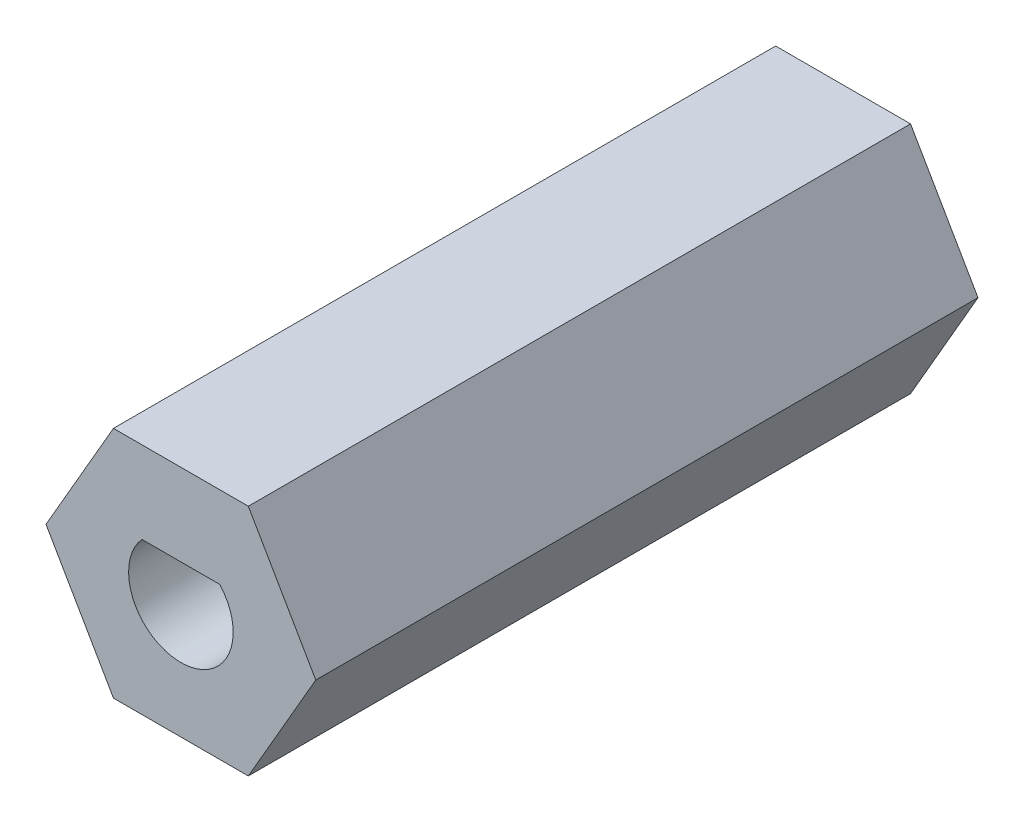
ISO-10303-21;
HEADER;
FILE_DESCRIPTION(('STEP AP214'),'2;1');
FILE_NAME('part.step','',(''),(''),'','','');
FILE_SCHEMA(('AUTOMOTIVE_DESIGN { 1 0 10303 214 1 1 1 1 }'));
ENDSEC;
DATA;
#1=APPLICATION_CONTEXT('core data for automotive mechanical design processes');
#2=APPLICATION_PROTOCOL_DEFINITION('international standard','automotive_design',2000,#1);
#3=PRODUCT_CONTEXT('',#1,'mechanical');
#4=PRODUCT('Part','Part','',(#3));
#5=PRODUCT_RELATED_PRODUCT_CATEGORY('part','',(#4));
#6=PRODUCT_DEFINITION_FORMATION('','',#4);
#7=PRODUCT_DEFINITION_CONTEXT('part definition',#1,'design');
#8=PRODUCT_DEFINITION('design','',#6,#7);
#9=PRODUCT_DEFINITION_SHAPE('','',#8);
#10=(LENGTH_UNIT() NAMED_UNIT(*) SI_UNIT(.MILLI.,.METRE.));
#11=(NAMED_UNIT(*) PLANE_ANGLE_UNIT() SI_UNIT($,.RADIAN.));
#12=(NAMED_UNIT(*) SI_UNIT($,.STERADIAN.) SOLID_ANGLE_UNIT());
#13=UNCERTAINTY_MEASURE_WITH_UNIT(LENGTH_MEASURE(1.E-05),#10,'distance_accuracy_value','');
#14=(GEOMETRIC_REPRESENTATION_CONTEXT(3) GLOBAL_UNCERTAINTY_ASSIGNED_CONTEXT((#13)) GLOBAL_UNIT_ASSIGNED_CONTEXT((#10,
#11,#12)) REPRESENTATION_CONTEXT('',''));
#15=CARTESIAN_POINT('',(0.,0.,0.));
#16=DIRECTION('',(0.,0.,1.));
#17=DIRECTION('',(1.,0.,0.));
#18=AXIS2_PLACEMENT_3D('',#15,#16,#17);
#19=CARTESIAN_POINT('',(1.935,3.35151831264578,19.));
#20=DIRECTION('',(-0.86602540378444,-0.499999999999998,0.));
#21=DIRECTION('',(0.499999999999998,-0.86602540378444,0.));
#22=AXIS2_PLACEMENT_3D('',#19,#20,#21);
#23=PLANE('',#22);
#24=DIRECTION('',(-0.499999999999998,0.86602540378444,0.));
#25=VECTOR('',#24,1.);
#26=CARTESIAN_POINT('',(1.935,3.35151831264578,0.));
#27=LINE('',#26,#25);
#28=CARTESIAN_POINT('',(3.86999999999999,0.,0.));
#29=VERTEX_POINT('',#28);
#30=CARTESIAN_POINT('',(1.935,3.35151831264578,0.));
#31=VERTEX_POINT('',#30);
#32=EDGE_CURVE('E139',#29,#31,#27,.T.);
#33=ORIENTED_EDGE('',*,*,#32,.T.);
#34=DIRECTION('',(0.,0.,-1.));
#35=VECTOR('',#34,1.);
#36=CARTESIAN_POINT('',(1.935,3.35151831264578,19.));
#37=LINE('',#36,#35);
#38=CARTESIAN_POINT('',(1.935,3.35151831264578,19.));
#39=VERTEX_POINT('',#38);
#40=EDGE_CURVE('E11',#39,#31,#37,.T.);
#41=ORIENTED_EDGE('',*,*,#40,.F.);
#42=DIRECTION('',(-0.499999999999998,0.86602540378444,0.));
#43=VECTOR('',#42,1.);
#44=CARTESIAN_POINT('',(1.935,3.35151831264578,19.));
#45=LINE('',#44,#43);
#46=CARTESIAN_POINT('',(3.86999999999999,0.,19.));
#47=VERTEX_POINT('',#46);
#48=EDGE_CURVE('E151',#47,#39,#45,.T.);
#49=ORIENTED_EDGE('',*,*,#48,.F.);
#50=DIRECTION('',(0.,0.,-1.));
#51=VECTOR('',#50,1.);
#52=CARTESIAN_POINT('',(3.86999999999999,0.,19.));
#53=LINE('',#52,#51);
#54=EDGE_CURVE('E135',#47,#29,#53,.T.);
#55=ORIENTED_EDGE('',*,*,#54,.T.);
#56=EDGE_LOOP('',(#33,#41,#49,#55));
#57=FACE_BOUND('',#56,.T.);
#58=ADVANCED_FACE('F43',(#57),#23,.F.);
#59=CARTESIAN_POINT('',(-1.935,3.35151831264578,19.));
#60=DIRECTION('',(0.,-1.,0.));
#61=DIRECTION('',(0.,0.,-1.));
#62=AXIS2_PLACEMENT_3D('',#59,#60,#61);
#63=PLANE('',#62);
#64=DIRECTION('',(-1.,0.,0.));
#65=VECTOR('',#64,1.);
#66=CARTESIAN_POINT('',(-1.935,3.35151831264578,0.));
#67=LINE('',#66,#65);
#68=CARTESIAN_POINT('',(-1.935,3.35151831264578,0.));
#69=VERTEX_POINT('',#68);
#70=EDGE_CURVE('E142',#31,#69,#67,.T.);
#71=ORIENTED_EDGE('',*,*,#70,.T.);
#72=DIRECTION('',(0.,0.,-1.));
#73=VECTOR('',#72,1.);
#74=CARTESIAN_POINT('',(-1.935,3.35151831264578,19.));
#75=LINE('',#74,#73);
#76=CARTESIAN_POINT('',(-1.935,3.35151831264578,19.));
#77=VERTEX_POINT('',#76);
#78=EDGE_CURVE('E50',#77,#69,#75,.T.);
#79=ORIENTED_EDGE('',*,*,#78,.F.);
#80=DIRECTION('',(-1.,0.,0.));
#81=VECTOR('',#80,1.);
#82=CARTESIAN_POINT('',(-1.935,3.35151831264578,19.));
#83=LINE('',#82,#81);
#84=EDGE_CURVE('E101',#39,#77,#83,.T.);
#85=ORIENTED_EDGE('',*,*,#84,.F.);
#86=ORIENTED_EDGE('',*,*,#40,.T.);
#87=EDGE_LOOP('',(#71,#79,#85,#86));
#88=FACE_BOUND('',#87,.T.);
#89=ADVANCED_FACE('F211',(#88),#63,.F.);
#90=CARTESIAN_POINT('',(-1.935,3.35151831264578,19.));
#91=DIRECTION('',(0.86602540378444,-0.499999999999998,0.));
#92=DIRECTION('',(0.499999999999998,0.86602540378444,0.));
#93=AXIS2_PLACEMENT_3D('',#90,#91,#92);
#94=PLANE('',#93);
#95=DIRECTION('',(-0.499999999999998,-0.86602540378444,0.));
#96=VECTOR('',#95,1.);
#97=CARTESIAN_POINT('',(-1.935,3.35151831264578,0.));
#98=LINE('',#97,#96);
#99=CARTESIAN_POINT('',(-3.86999999999999,0.,0.));
#100=VERTEX_POINT('',#99);
#101=EDGE_CURVE('E145',#69,#100,#98,.T.);
#102=ORIENTED_EDGE('',*,*,#101,.T.);
#103=DIRECTION('',(0.,0.,-1.));
#104=VECTOR('',#103,1.);
#105=CARTESIAN_POINT('',(-3.86999999999999,0.,19.));
#106=LINE('',#105,#104);
#107=CARTESIAN_POINT('',(-3.86999999999999,0.,19.));
#108=VERTEX_POINT('',#107);
#109=EDGE_CURVE('E130',#108,#100,#106,.T.);
#110=ORIENTED_EDGE('',*,*,#109,.F.);
#111=DIRECTION('',(-0.499999999999998,-0.86602540378444,0.));
#112=VECTOR('',#111,1.);
#113=CARTESIAN_POINT('',(-1.935,3.35151831264578,19.));
#114=LINE('',#113,#112);
#115=EDGE_CURVE('E118',#77,#108,#114,.T.);
#116=ORIENTED_EDGE('',*,*,#115,.F.);
#117=ORIENTED_EDGE('',*,*,#78,.T.);
#118=EDGE_LOOP('',(#102,#110,#116,#117));
#119=FACE_BOUND('',#118,.T.);
#120=ADVANCED_FACE('F157',(#119),#94,.F.);
#121=CARTESIAN_POINT('',(-1.935,-3.35151831264578,19.));
#122=DIRECTION('',(0.86602540378444,0.499999999999998,0.));
#123=DIRECTION('',(-0.499999999999998,0.86602540378444,0.));
#124=AXIS2_PLACEMENT_3D('',#121,#122,#123);
#125=PLANE('',#124);
#126=DIRECTION('',(0.499999999999998,-0.86602540378444,0.));
#127=VECTOR('',#126,1.);
#128=CARTESIAN_POINT('',(-1.935,-3.35151831264578,0.));
#129=LINE('',#128,#127);
#130=CARTESIAN_POINT('',(-1.935,-3.35151831264578,0.));
#131=VERTEX_POINT('',#130);
#132=EDGE_CURVE('E127',#100,#131,#129,.T.);
#133=ORIENTED_EDGE('',*,*,#132,.T.);
#134=DIRECTION('',(0.,0.,-1.));
#135=VECTOR('',#134,1.);
#136=CARTESIAN_POINT('',(-1.935,-3.35151831264578,19.));
#137=LINE('',#136,#135);
#138=CARTESIAN_POINT('',(-1.935,-3.35151831264578,19.));
#139=VERTEX_POINT('',#138);
#140=EDGE_CURVE('E124',#139,#131,#137,.T.);
#141=ORIENTED_EDGE('',*,*,#140,.F.);
#142=DIRECTION('',(0.499999999999998,-0.86602540378444,0.));
#143=VECTOR('',#142,1.);
#144=CARTESIAN_POINT('',(-1.935,-3.35151831264578,19.));
#145=LINE('',#144,#143);
#146=EDGE_CURVE('E111',#108,#139,#145,.T.);
#147=ORIENTED_EDGE('',*,*,#146,.F.);
#148=ORIENTED_EDGE('',*,*,#109,.T.);
#149=EDGE_LOOP('',(#133,#141,#147,#148));
#150=FACE_BOUND('',#149,.T.);
#151=ADVANCED_FACE('F125',(#150),#125,.F.);
#152=CARTESIAN_POINT('',(-1.935,-3.35151831264578,19.));
#153=DIRECTION('',(0.,1.,0.));
#154=DIRECTION('',(0.,0.,1.));
#155=AXIS2_PLACEMENT_3D('',#152,#153,#154);
#156=PLANE('',#155);
#157=DIRECTION('',(1.,0.,0.));
#158=VECTOR('',#157,1.);
#159=CARTESIAN_POINT('',(-1.935,-3.35151831264578,0.));
#160=LINE('',#159,#158);
#161=CARTESIAN_POINT('',(1.935,-3.35151831264578,0.));
#162=VERTEX_POINT('',#161);
#163=EDGE_CURVE('E148',#131,#162,#160,.T.);
#164=ORIENTED_EDGE('',*,*,#163,.T.);
#165=DIRECTION('',(0.,0.,-1.));
#166=VECTOR('',#165,1.);
#167=CARTESIAN_POINT('',(1.935,-3.35151831264578,19.));
#168=LINE('',#167,#166);
#169=CARTESIAN_POINT('',(1.935,-3.35151831264578,19.));
#170=VERTEX_POINT('',#169);
#171=EDGE_CURVE('E131',#170,#162,#168,.T.);
#172=ORIENTED_EDGE('',*,*,#171,.F.);
#173=DIRECTION('',(1.,0.,0.));
#174=VECTOR('',#173,1.);
#175=CARTESIAN_POINT('',(-1.935,-3.35151831264578,19.));
#176=LINE('',#175,#174);
#177=EDGE_CURVE('E115',#139,#170,#176,.T.);
#178=ORIENTED_EDGE('',*,*,#177,.F.);
#179=ORIENTED_EDGE('',*,*,#140,.T.);
#180=EDGE_LOOP('',(#164,#172,#178,#179));
#181=FACE_BOUND('',#180,.T.);
#182=ADVANCED_FACE('F133',(#181),#156,.F.);
#183=CARTESIAN_POINT('',(1.935,-3.35151831264578,19.));
#184=DIRECTION('',(-0.86602540378444,0.499999999999998,0.));
#185=DIRECTION('',(-0.499999999999998,-0.86602540378444,0.));
#186=AXIS2_PLACEMENT_3D('',#183,#184,#185);
#187=PLANE('',#186);
#188=DIRECTION('',(0.499999999999998,0.86602540378444,0.));
#189=VECTOR('',#188,1.);
#190=CARTESIAN_POINT('',(1.935,-3.35151831264578,0.));
#191=LINE('',#190,#189);
#192=EDGE_CURVE('E93',#162,#29,#191,.T.);
#193=ORIENTED_EDGE('',*,*,#192,.T.);
#194=ORIENTED_EDGE('',*,*,#54,.F.);
#195=DIRECTION('',(0.499999999999998,0.86602540378444,0.));
#196=VECTOR('',#195,1.);
#197=CARTESIAN_POINT('',(1.935,-3.35151831264578,19.));
#198=LINE('',#197,#196);
#199=EDGE_CURVE('E66',#170,#47,#198,.T.);
#200=ORIENTED_EDGE('',*,*,#199,.F.);
#201=ORIENTED_EDGE('',*,*,#171,.T.);
#202=EDGE_LOOP('',(#193,#194,#200,#201));
#203=FACE_BOUND('',#202,.T.);
#204=ADVANCED_FACE('F161',(#203),#187,.F.);
#205=CARTESIAN_POINT('',(0.,0.,19.));
#206=DIRECTION('',(0.,0.,1.));
#207=DIRECTION('',(1.,0.,0.));
#208=AXIS2_PLACEMENT_3D('',#205,#206,#207);
#209=PLANE('',#208);
#210=CARTESIAN_POINT('',(0.,0.,19.));
#211=DIRECTION('',(0.,0.,1.));
#212=DIRECTION('',(1.,0.,0.));
#213=AXIS2_PLACEMENT_3D('',#210,#211,#212);
#214=CIRCLE('',#213,1.5);
#215=CARTESIAN_POINT('',(-1.11803398874989,1.,19.));
#216=VERTEX_POINT('',#215);
#217=CARTESIAN_POINT('',(1.11803398874989,1.,19.));
#218=VERTEX_POINT('',#217);
#219=EDGE_CURVE('E57',#216,#218,#214,.T.);
#220=ORIENTED_EDGE('',*,*,#219,.F.);
#221=DIRECTION('',(-1.,0.,0.));
#222=VECTOR('',#221,1.);
#223=CARTESIAN_POINT('',(-1.11803398874989,1.,19.));
#224=LINE('',#223,#222);
#225=EDGE_CURVE('E172',#218,#216,#224,.T.);
#226=ORIENTED_EDGE('',*,*,#225,.F.);
#227=EDGE_LOOP('',(#220,#226));
#228=FACE_BOUND('',#227,.T.);
#229=ORIENTED_EDGE('',*,*,#48,.T.);
#230=ORIENTED_EDGE('',*,*,#84,.T.);
#231=ORIENTED_EDGE('',*,*,#115,.T.);
#232=ORIENTED_EDGE('',*,*,#146,.T.);
#233=ORIENTED_EDGE('',*,*,#177,.T.);
#234=ORIENTED_EDGE('',*,*,#199,.T.);
#235=EDGE_LOOP('',(#229,#230,#231,#232,#233,#234));
#236=FACE_BOUND('',#235,.T.);
#237=ADVANCED_FACE('F113',(#228,#236),#209,.T.);
#238=CARTESIAN_POINT('',(0.,0.,0.));
#239=DIRECTION('',(0.,0.,1.));
#240=DIRECTION('',(1.,0.,0.));
#241=AXIS2_PLACEMENT_3D('',#238,#239,#240);
#242=PLANE('',#241);
#243=CARTESIAN_POINT('',(0.,0.,0.));
#244=DIRECTION('',(0.,0.,-1.));
#245=DIRECTION('',(-1.,0.,0.));
#246=AXIS2_PLACEMENT_3D('',#243,#244,#245);
#247=CIRCLE('',#246,1.1);
#248=CARTESIAN_POINT('',(-1.1,0.,0.));
#249=VERTEX_POINT('',#248);
#250=EDGE_CURVE('E182',#249,#249,#247,.T.);
#251=ORIENTED_EDGE('',*,*,#250,.F.);
#252=EDGE_LOOP('',(#251));
#253=FACE_BOUND('',#252,.T.);
#254=ORIENTED_EDGE('',*,*,#32,.F.);
#255=ORIENTED_EDGE('',*,*,#192,.F.);
#256=ORIENTED_EDGE('',*,*,#163,.F.);
#257=ORIENTED_EDGE('',*,*,#132,.F.);
#258=ORIENTED_EDGE('',*,*,#101,.F.);
#259=ORIENTED_EDGE('',*,*,#70,.F.);
#260=EDGE_LOOP('',(#254,#255,#256,#257,#258,#259));
#261=FACE_BOUND('',#260,.T.);
#262=ADVANCED_FACE('F160',(#253,#261),#242,.F.);
#263=CARTESIAN_POINT('',(0.,0.,11.));
#264=DIRECTION('',(0.,0.,1.));
#265=DIRECTION('',(1.,0.,0.));
#266=AXIS2_PLACEMENT_3D('',#263,#264,#265);
#267=CYLINDRICAL_SURFACE('',#266,1.5);
#268=ORIENTED_EDGE('',*,*,#219,.T.);
#269=DIRECTION('',(0.,0.,1.));
#270=VECTOR('',#269,1.);
#271=CARTESIAN_POINT('',(1.11803398874989,1.,11.));
#272=LINE('',#271,#270);
#273=CARTESIAN_POINT('',(1.11803398874989,1.,11.));
#274=VERTEX_POINT('',#273);
#275=EDGE_CURVE('E168',#274,#218,#272,.T.);
#276=ORIENTED_EDGE('',*,*,#275,.F.);
#277=CARTESIAN_POINT('',(0.,0.,11.));
#278=DIRECTION('',(0.,0.,1.));
#279=DIRECTION('',(1.,0.,0.));
#280=AXIS2_PLACEMENT_3D('',#277,#278,#279);
#281=CIRCLE('',#280,1.5);
#282=CARTESIAN_POINT('',(-1.11803398874989,1.,11.));
#283=VERTEX_POINT('',#282);
#284=EDGE_CURVE('E175',#283,#274,#281,.T.);
#285=ORIENTED_EDGE('',*,*,#284,.F.);
#286=DIRECTION('',(0.,0.,1.));
#287=VECTOR('',#286,1.);
#288=CARTESIAN_POINT('',(-1.11803398874989,1.,11.));
#289=LINE('',#288,#287);
#290=EDGE_CURVE('E143',#283,#216,#289,.T.);
#291=ORIENTED_EDGE('',*,*,#290,.T.);
#292=EDGE_LOOP('',(#268,#276,#285,#291));
#293=FACE_BOUND('',#292,.T.);
#294=ADVANCED_FACE('F198',(#293),#267,.F.);
#295=CARTESIAN_POINT('',(-1.11803398874989,1.,11.));
#296=DIRECTION('',(0.,1.,0.));
#297=DIRECTION('',(0.,0.,1.));
#298=AXIS2_PLACEMENT_3D('',#295,#296,#297);
#299=PLANE('',#298);
#300=ORIENTED_EDGE('',*,*,#225,.T.);
#301=ORIENTED_EDGE('',*,*,#290,.F.);
#302=DIRECTION('',(-1.,0.,0.));
#303=VECTOR('',#302,1.);
#304=CARTESIAN_POINT('',(-1.11803398874989,1.,11.));
#305=LINE('',#304,#303);
#306=EDGE_CURVE('E170',#274,#283,#305,.T.);
#307=ORIENTED_EDGE('',*,*,#306,.F.);
#308=ORIENTED_EDGE('',*,*,#275,.T.);
#309=EDGE_LOOP('',(#300,#301,#307,#308));
#310=FACE_BOUND('',#309,.T.);
#311=ADVANCED_FACE('F204',(#310),#299,.F.);
#312=CARTESIAN_POINT('',(0.,0.,11.));
#313=DIRECTION('',(0.,0.,1.));
#314=DIRECTION('',(1.,0.,0.));
#315=AXIS2_PLACEMENT_3D('',#312,#313,#314);
#316=PLANE('',#315);
#317=ORIENTED_EDGE('',*,*,#284,.T.);
#318=ORIENTED_EDGE('',*,*,#306,.T.);
#319=EDGE_LOOP('',(#317,#318));
#320=FACE_BOUND('',#319,.T.);
#321=ADVANCED_FACE('F193',(#320),#316,.T.);
#322=CARTESIAN_POINT('',(0.,0.,8.));
#323=DIRECTION('',(0.,0.,-1.));
#324=DIRECTION('',(-1.,0.,0.));
#325=AXIS2_PLACEMENT_3D('',#322,#323,#324);
#326=CYLINDRICAL_SURFACE('',#325,1.1);
#327=CARTESIAN_POINT('',(0.,0.,8.));
#328=DIRECTION('',(0.,0.,-1.));
#329=DIRECTION('',(-1.,0.,0.));
#330=AXIS2_PLACEMENT_3D('',#327,#328,#329);
#331=CIRCLE('',#330,1.1);
#332=CARTESIAN_POINT('',(-1.1,0.,8.));
#333=VERTEX_POINT('',#332);
#334=EDGE_CURVE('E177',#333,#333,#331,.T.);
#335=ORIENTED_EDGE('',*,*,#334,.F.);
#336=EDGE_LOOP('',(#335));
#337=FACE_BOUND('',#336,.T.);
#338=ORIENTED_EDGE('',*,*,#250,.T.);
#339=EDGE_LOOP('',(#338));
#340=FACE_BOUND('',#339,.T.);
#341=ADVANCED_FACE('F190',(#337,#340),#326,.F.);
#342=CARTESIAN_POINT('',(0.,0.,8.));
#343=DIRECTION('',(0.,0.,-1.));
#344=DIRECTION('',(-1.,0.,0.));
#345=AXIS2_PLACEMENT_3D('',#342,#343,#344);
#346=PLANE('',#345);
#347=ORIENTED_EDGE('',*,*,#334,.T.);
#348=EDGE_LOOP('',(#347));
#349=FACE_BOUND('',#348,.T.);
#350=ADVANCED_FACE('F188',(#349),#346,.T.);
#351=CLOSED_SHELL('',(#58,#89,#120,#151,#182,#204,#237,#262,#294,#311,#321,#341,#350));
#352=MANIFOLD_SOLID_BREP('B2',#351);
#353=ADVANCED_BREP_SHAPE_REPRESENTATION('',(#18,#352),#14);
#354=SHAPE_DEFINITION_REPRESENTATION(#9,#353);
ENDSEC;
END-ISO-10303-21;
